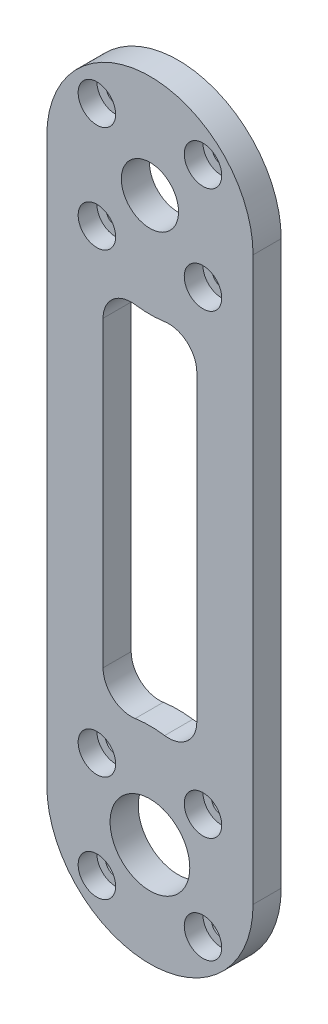
ISO-10303-21;
HEADER;
FILE_DESCRIPTION(('STEP AP214'),'2;1');
FILE_NAME('part.step','',(''),(''),'','','');
FILE_SCHEMA(('AUTOMOTIVE_DESIGN { 1 0 10303 214 1 1 1 1 }'));
ENDSEC;
DATA;
#1=APPLICATION_CONTEXT('core data for automotive mechanical design processes');
#2=APPLICATION_PROTOCOL_DEFINITION('international standard','automotive_design',2000,#1);
#3=PRODUCT_CONTEXT('',#1,'mechanical');
#4=PRODUCT('Part','Part','',(#3));
#5=PRODUCT_RELATED_PRODUCT_CATEGORY('part','',(#4));
#6=PRODUCT_DEFINITION_FORMATION('','',#4);
#7=PRODUCT_DEFINITION_CONTEXT('part definition',#1,'design');
#8=PRODUCT_DEFINITION('design','',#6,#7);
#9=PRODUCT_DEFINITION_SHAPE('','',#8);
#10=(LENGTH_UNIT() NAMED_UNIT(*) SI_UNIT(.MILLI.,.METRE.));
#11=(NAMED_UNIT(*) PLANE_ANGLE_UNIT() SI_UNIT($,.RADIAN.));
#12=(NAMED_UNIT(*) SI_UNIT($,.STERADIAN.) SOLID_ANGLE_UNIT());
#13=UNCERTAINTY_MEASURE_WITH_UNIT(LENGTH_MEASURE(1.E-05),#10,'distance_accuracy_value','');
#14=(GEOMETRIC_REPRESENTATION_CONTEXT(3) GLOBAL_UNCERTAINTY_ASSIGNED_CONTEXT((#13)) GLOBAL_UNIT_ASSIGNED_CONTEXT((#10,
#11,#12)) REPRESENTATION_CONTEXT('',''));
#15=CARTESIAN_POINT('',(0.,0.,0.));
#16=DIRECTION('',(0.,0.,1.));
#17=DIRECTION('',(1.,0.,0.));
#18=AXIS2_PLACEMENT_3D('',#15,#16,#17);
#19=CARTESIAN_POINT('',(5.65685424949247,24.3431457505077,-8.62670273047588));
#20=DIRECTION('',(0.,0.,1.));
#21=DIRECTION('',(1.,0.,0.));
#22=AXIS2_PLACEMENT_3D('',#19,#20,#21);
#23=CYLINDRICAL_SURFACE('',#22,1.);
#24=CARTESIAN_POINT('',(5.65685424949247,24.3431457505077,0.));
#25=DIRECTION('',(0.,0.,1.));
#26=DIRECTION('',(1.,0.,0.));
#27=AXIS2_PLACEMENT_3D('',#24,#25,#26);
#28=CIRCLE('',#27,1.);
#29=CARTESIAN_POINT('',(6.65685424949247,24.3431457505077,0.));
#30=VERTEX_POINT('',#29);
#31=EDGE_CURVE('E426',#30,#30,#28,.F.);
#32=ORIENTED_EDGE('',*,*,#31,.T.);
#33=EDGE_LOOP('',(#32));
#34=FACE_BOUND('',#33,.T.);
#35=CARTESIAN_POINT('',(5.65685424949247,24.3431457505077,1.));
#36=DIRECTION('',(0.,0.,1.));
#37=DIRECTION('',(1.,0.,0.));
#38=AXIS2_PLACEMENT_3D('',#35,#36,#37);
#39=CIRCLE('',#38,1.);
#40=CARTESIAN_POINT('',(6.65685424949247,24.3431457505077,1.));
#41=VERTEX_POINT('',#40);
#42=EDGE_CURVE('E436',#41,#41,#39,.F.);
#43=ORIENTED_EDGE('',*,*,#42,.F.);
#44=EDGE_LOOP('',(#43));
#45=FACE_BOUND('',#44,.T.);
#46=ADVANCED_FACE('F41',(#34,#45),#23,.F.);
#47=CARTESIAN_POINT('',(-5.65685424949235,24.3431457505076,-8.62670273047588));
#48=DIRECTION('',(0.,0.,1.));
#49=DIRECTION('',(1.,0.,0.));
#50=AXIS2_PLACEMENT_3D('',#47,#48,#49);
#51=CYLINDRICAL_SURFACE('',#50,1.);
#52=CARTESIAN_POINT('',(-5.65685424949235,24.3431457505076,0.));
#53=DIRECTION('',(0.,0.,1.));
#54=DIRECTION('',(1.,0.,0.));
#55=AXIS2_PLACEMENT_3D('',#52,#53,#54);
#56=CIRCLE('',#55,1.);
#57=CARTESIAN_POINT('',(-4.65685424949235,24.3431457505076,0.));
#58=VERTEX_POINT('',#57);
#59=EDGE_CURVE('E423',#58,#58,#56,.F.);
#60=ORIENTED_EDGE('',*,*,#59,.T.);
#61=EDGE_LOOP('',(#60));
#62=FACE_BOUND('',#61,.T.);
#63=CARTESIAN_POINT('',(-5.65685424949235,24.3431457505076,1.));
#64=DIRECTION('',(0.,0.,1.));
#65=DIRECTION('',(1.,0.,0.));
#66=AXIS2_PLACEMENT_3D('',#63,#64,#65);
#67=CIRCLE('',#66,1.);
#68=CARTESIAN_POINT('',(-4.65685424949235,24.3431457505076,1.));
#69=VERTEX_POINT('',#68);
#70=EDGE_CURVE('E434',#69,#69,#67,.F.);
#71=ORIENTED_EDGE('',*,*,#70,.F.);
#72=EDGE_LOOP('',(#71));
#73=FACE_BOUND('',#72,.T.);
#74=ADVANCED_FACE('F262',(#62,#73),#51,.F.);
#75=CARTESIAN_POINT('',(-5.65685424949243,35.6568542494923,-8.62670273047588));
#76=DIRECTION('',(0.,0.,1.));
#77=DIRECTION('',(1.,0.,0.));
#78=AXIS2_PLACEMENT_3D('',#75,#76,#77);
#79=CYLINDRICAL_SURFACE('',#78,1.);
#80=CARTESIAN_POINT('',(-5.65685424949243,35.6568542494923,0.));
#81=DIRECTION('',(0.,0.,1.));
#82=DIRECTION('',(1.,0.,0.));
#83=AXIS2_PLACEMENT_3D('',#80,#81,#82);
#84=CIRCLE('',#83,1.);
#85=CARTESIAN_POINT('',(-4.65685424949243,35.6568542494923,0.));
#86=VERTEX_POINT('',#85);
#87=EDGE_CURVE('E420',#86,#86,#84,.F.);
#88=ORIENTED_EDGE('',*,*,#87,.T.);
#89=EDGE_LOOP('',(#88));
#90=FACE_BOUND('',#89,.T.);
#91=CARTESIAN_POINT('',(-5.65685424949243,35.6568542494923,1.));
#92=DIRECTION('',(0.,0.,1.));
#93=DIRECTION('',(1.,0.,0.));
#94=AXIS2_PLACEMENT_3D('',#91,#92,#93);
#95=CIRCLE('',#94,1.);
#96=CARTESIAN_POINT('',(-4.65685424949243,35.6568542494923,1.));
#97=VERTEX_POINT('',#96);
#98=EDGE_CURVE('E444',#97,#97,#95,.F.);
#99=ORIENTED_EDGE('',*,*,#98,.F.);
#100=EDGE_LOOP('',(#99));
#101=FACE_BOUND('',#100,.T.);
#102=ADVANCED_FACE('F268',(#90,#101),#79,.F.);
#103=CARTESIAN_POINT('',(5.65685424949234,35.6568542494924,-8.62670273047588));
#104=DIRECTION('',(0.,0.,1.));
#105=DIRECTION('',(1.,0.,0.));
#106=AXIS2_PLACEMENT_3D('',#103,#104,#105);
#107=CYLINDRICAL_SURFACE('',#106,1.);
#108=CARTESIAN_POINT('',(5.65685424949234,35.6568542494924,0.));
#109=DIRECTION('',(0.,0.,1.));
#110=DIRECTION('',(1.,0.,0.));
#111=AXIS2_PLACEMENT_3D('',#108,#109,#110);
#112=CIRCLE('',#111,1.);
#113=CARTESIAN_POINT('',(6.65685424949234,35.6568542494924,0.));
#114=VERTEX_POINT('',#113);
#115=EDGE_CURVE('E386',#114,#114,#112,.F.);
#116=ORIENTED_EDGE('',*,*,#115,.T.);
#117=EDGE_LOOP('',(#116));
#118=FACE_BOUND('',#117,.T.);
#119=CARTESIAN_POINT('',(5.65685424949234,35.6568542494924,1.));
#120=DIRECTION('',(0.,0.,1.));
#121=DIRECTION('',(1.,0.,0.));
#122=AXIS2_PLACEMENT_3D('',#119,#120,#121);
#123=CIRCLE('',#122,1.);
#124=CARTESIAN_POINT('',(6.65685424949234,35.6568542494924,1.));
#125=VERTEX_POINT('',#124);
#126=EDGE_CURVE('E417',#125,#125,#123,.F.);
#127=ORIENTED_EDGE('',*,*,#126,.F.);
#128=EDGE_LOOP('',(#127));
#129=FACE_BOUND('',#128,.T.);
#130=ADVANCED_FACE('F286',(#118,#129),#107,.F.);
#131=CARTESIAN_POINT('',(-5.65685424949239,-35.6568542494924,-12.0208152801713));
#132=DIRECTION('',(0.,0.,1.));
#133=DIRECTION('',(1.,0.,0.));
#134=AXIS2_PLACEMENT_3D('',#131,#132,#133);
#135=CYLINDRICAL_SURFACE('',#134,1.1);
#136=CARTESIAN_POINT('',(-5.65685424949239,-35.6568542494924,0.));
#137=DIRECTION('',(0.,0.,1.));
#138=DIRECTION('',(1.,0.,0.));
#139=AXIS2_PLACEMENT_3D('',#136,#137,#138);
#140=CIRCLE('',#139,1.1);
#141=CARTESIAN_POINT('',(-4.55685424949239,-35.6568542494924,0.));
#142=VERTEX_POINT('',#141);
#143=EDGE_CURVE('E372',#142,#142,#140,.F.);
#144=ORIENTED_EDGE('',*,*,#143,.T.);
#145=EDGE_LOOP('',(#144));
#146=FACE_BOUND('',#145,.T.);
#147=CARTESIAN_POINT('',(-5.65685424949239,-35.6568542494924,1.));
#148=DIRECTION('',(0.,0.,1.));
#149=DIRECTION('',(1.,0.,0.));
#150=AXIS2_PLACEMENT_3D('',#147,#148,#149);
#151=CIRCLE('',#150,1.1);
#152=CARTESIAN_POINT('',(-4.55685424949239,-35.6568542494924,1.));
#153=VERTEX_POINT('',#152);
#154=EDGE_CURVE('E389',#153,#153,#151,.F.);
#155=ORIENTED_EDGE('',*,*,#154,.F.);
#156=EDGE_LOOP('',(#155));
#157=FACE_BOUND('',#156,.T.);
#158=ADVANCED_FACE('F289',(#146,#157),#135,.F.);
#159=CARTESIAN_POINT('',(5.65685424949235,-35.6568542494924,-12.0208152801713));
#160=DIRECTION('',(0.,0.,1.));
#161=DIRECTION('',(1.,0.,0.));
#162=AXIS2_PLACEMENT_3D('',#159,#160,#161);
#163=CYLINDRICAL_SURFACE('',#162,1.1);
#164=CARTESIAN_POINT('',(5.65685424949235,-35.6568542494924,0.));
#165=DIRECTION('',(0.,0.,1.));
#166=DIRECTION('',(1.,0.,0.));
#167=AXIS2_PLACEMENT_3D('',#164,#165,#166);
#168=CIRCLE('',#167,1.1);
#169=CARTESIAN_POINT('',(6.75685424949235,-35.6568542494924,0.));
#170=VERTEX_POINT('',#169);
#171=EDGE_CURVE('E367',#170,#170,#168,.F.);
#172=ORIENTED_EDGE('',*,*,#171,.T.);
#173=EDGE_LOOP('',(#172));
#174=FACE_BOUND('',#173,.T.);
#175=CARTESIAN_POINT('',(5.65685424949235,-35.6568542494924,1.));
#176=DIRECTION('',(0.,0.,1.));
#177=DIRECTION('',(1.,0.,0.));
#178=AXIS2_PLACEMENT_3D('',#175,#176,#177);
#179=CIRCLE('',#178,1.1);
#180=CARTESIAN_POINT('',(6.75685424949235,-35.6568542494924,1.));
#181=VERTEX_POINT('',#180);
#182=EDGE_CURVE('E373',#181,#181,#179,.F.);
#183=ORIENTED_EDGE('',*,*,#182,.F.);
#184=EDGE_LOOP('',(#183));
#185=FACE_BOUND('',#184,.T.);
#186=ADVANCED_FACE('F321',(#174,#185),#163,.F.);
#187=CARTESIAN_POINT('',(-5.65685424949231,-24.3431457505075,-12.0208152801713));
#188=DIRECTION('',(0.,0.,1.));
#189=DIRECTION('',(1.,0.,0.));
#190=AXIS2_PLACEMENT_3D('',#187,#188,#189);
#191=CYLINDRICAL_SURFACE('',#190,1.1);
#192=CARTESIAN_POINT('',(-5.65685424949231,-24.3431457505075,0.));
#193=DIRECTION('',(0.,0.,1.));
#194=DIRECTION('',(1.,0.,0.));
#195=AXIS2_PLACEMENT_3D('',#192,#193,#194);
#196=CIRCLE('',#195,1.1);
#197=CARTESIAN_POINT('',(-4.55685424949231,-24.3431457505075,0.));
#198=VERTEX_POINT('',#197);
#199=EDGE_CURVE('E369',#198,#198,#196,.F.);
#200=ORIENTED_EDGE('',*,*,#199,.T.);
#201=EDGE_LOOP('',(#200));
#202=FACE_BOUND('',#201,.T.);
#203=CARTESIAN_POINT('',(-5.65685424949231,-24.3431457505075,1.));
#204=DIRECTION('',(0.,0.,1.));
#205=DIRECTION('',(1.,0.,0.));
#206=AXIS2_PLACEMENT_3D('',#203,#204,#205);
#207=CIRCLE('',#206,1.1);
#208=CARTESIAN_POINT('',(-4.55685424949231,-24.3431457505075,1.));
#209=VERTEX_POINT('',#208);
#210=EDGE_CURVE('E378',#209,#209,#207,.F.);
#211=ORIENTED_EDGE('',*,*,#210,.F.);
#212=EDGE_LOOP('',(#211));
#213=FACE_BOUND('',#212,.T.);
#214=ADVANCED_FACE('F325',(#202,#213),#191,.F.);
#215=CARTESIAN_POINT('',(5.65685424949239,-24.3431457505076,-12.0208152801713));
#216=DIRECTION('',(0.,0.,1.));
#217=DIRECTION('',(1.,0.,0.));
#218=AXIS2_PLACEMENT_3D('',#215,#216,#217);
#219=CYLINDRICAL_SURFACE('',#218,1.1);
#220=CARTESIAN_POINT('',(5.65685424949239,-24.3431457505076,0.));
#221=DIRECTION('',(0.,0.,1.));
#222=DIRECTION('',(1.,0.,0.));
#223=AXIS2_PLACEMENT_3D('',#220,#221,#222);
#224=CIRCLE('',#223,1.1);
#225=CARTESIAN_POINT('',(6.75685424949239,-24.3431457505076,0.));
#226=VERTEX_POINT('',#225);
#227=EDGE_CURVE('E221',#226,#226,#224,.F.);
#228=ORIENTED_EDGE('',*,*,#227,.T.);
#229=EDGE_LOOP('',(#228));
#230=FACE_BOUND('',#229,.T.);
#231=CARTESIAN_POINT('',(5.65685424949239,-24.3431457505076,1.));
#232=DIRECTION('',(0.,0.,1.));
#233=DIRECTION('',(1.,0.,0.));
#234=AXIS2_PLACEMENT_3D('',#231,#232,#233);
#235=CIRCLE('',#234,1.1);
#236=CARTESIAN_POINT('',(6.75685424949239,-24.3431457505076,1.));
#237=VERTEX_POINT('',#236);
#238=EDGE_CURVE('E348',#237,#237,#235,.F.);
#239=ORIENTED_EDGE('',*,*,#238,.F.);
#240=EDGE_LOOP('',(#239));
#241=FACE_BOUND('',#240,.T.);
#242=ADVANCED_FACE('F329',(#230,#241),#219,.F.);
#243=CARTESIAN_POINT('',(0.,30.,3.));
#244=DIRECTION('',(0.,0.,-1.));
#245=DIRECTION('',(-1.,0.,0.));
#246=AXIS2_PLACEMENT_3D('',#243,#244,#245);
#247=CYLINDRICAL_SURFACE('',#246,11.);
#248=CARTESIAN_POINT('',(0.,30.,0.));
#249=DIRECTION('',(0.,0.,1.));
#250=DIRECTION('',(1.,0.,0.));
#251=AXIS2_PLACEMENT_3D('',#248,#249,#250);
#252=CIRCLE('',#251,11.);
#253=CARTESIAN_POINT('',(11.,30.,0.));
#254=VERTEX_POINT('',#253);
#255=CARTESIAN_POINT('',(-11.,30.,0.));
#256=VERTEX_POINT('',#255);
#257=EDGE_CURVE('E154',#254,#256,#252,.T.);
#258=ORIENTED_EDGE('',*,*,#257,.T.);
#259=DIRECTION('',(0.,0.,-1.));
#260=VECTOR('',#259,1.);
#261=CARTESIAN_POINT('',(-11.,30.,3.));
#262=LINE('',#261,#260);
#263=CARTESIAN_POINT('',(-11.,30.,3.));
#264=VERTEX_POINT('',#263);
#265=EDGE_CURVE('E135',#264,#256,#262,.T.);
#266=ORIENTED_EDGE('',*,*,#265,.F.);
#267=CARTESIAN_POINT('',(0.,30.,3.));
#268=DIRECTION('',(0.,0.,1.));
#269=DIRECTION('',(1.,0.,0.));
#270=AXIS2_PLACEMENT_3D('',#267,#268,#269);
#271=CIRCLE('',#270,11.);
#272=CARTESIAN_POINT('',(11.,30.,3.));
#273=VERTEX_POINT('',#272);
#274=EDGE_CURVE('E142',#273,#264,#271,.T.);
#275=ORIENTED_EDGE('',*,*,#274,.F.);
#276=DIRECTION('',(0.,0.,-1.));
#277=VECTOR('',#276,1.);
#278=CARTESIAN_POINT('',(11.,30.,3.));
#279=LINE('',#278,#277);
#280=EDGE_CURVE('E227',#273,#254,#279,.T.);
#281=ORIENTED_EDGE('',*,*,#280,.T.);
#282=EDGE_LOOP('',(#258,#266,#275,#281));
#283=FACE_BOUND('',#282,.T.);
#284=ADVANCED_FACE('F152',(#283),#247,.T.);
#285=CARTESIAN_POINT('',(-11.,0.,3.));
#286=DIRECTION('',(1.,0.,0.));
#287=DIRECTION('',(0.,1.,0.));
#288=AXIS2_PLACEMENT_3D('',#285,#286,#287);
#289=PLANE('',#288);
#290=DIRECTION('',(0.,-1.,0.));
#291=VECTOR('',#290,1.);
#292=CARTESIAN_POINT('',(-11.,0.,0.));
#293=LINE('',#292,#291);
#294=CARTESIAN_POINT('',(-11.,-30.,0.));
#295=VERTEX_POINT('',#294);
#296=EDGE_CURVE('E235',#256,#295,#293,.T.);
#297=ORIENTED_EDGE('',*,*,#296,.T.);
#298=DIRECTION('',(0.,0.,-1.));
#299=VECTOR('',#298,1.);
#300=CARTESIAN_POINT('',(-11.,-30.,3.));
#301=LINE('',#300,#299);
#302=CARTESIAN_POINT('',(-11.,-30.,3.));
#303=VERTEX_POINT('',#302);
#304=EDGE_CURVE('E138',#303,#295,#301,.T.);
#305=ORIENTED_EDGE('',*,*,#304,.F.);
#306=DIRECTION('',(0.,-1.,0.));
#307=VECTOR('',#306,1.);
#308=CARTESIAN_POINT('',(-11.,0.,3.));
#309=LINE('',#308,#307);
#310=EDGE_CURVE('E131',#264,#303,#309,.T.);
#311=ORIENTED_EDGE('',*,*,#310,.F.);
#312=ORIENTED_EDGE('',*,*,#265,.T.);
#313=EDGE_LOOP('',(#297,#305,#311,#312));
#314=FACE_BOUND('',#313,.T.);
#315=ADVANCED_FACE('F133',(#314),#289,.F.);
#316=CARTESIAN_POINT('',(0.,-30.,3.));
#317=DIRECTION('',(0.,0.,-1.));
#318=DIRECTION('',(-1.,0.,0.));
#319=AXIS2_PLACEMENT_3D('',#316,#317,#318);
#320=CYLINDRICAL_SURFACE('',#319,11.);
#321=CARTESIAN_POINT('',(0.,-30.,0.));
#322=DIRECTION('',(0.,0.,1.));
#323=DIRECTION('',(1.,0.,0.));
#324=AXIS2_PLACEMENT_3D('',#321,#322,#323);
#325=CIRCLE('',#324,11.);
#326=CARTESIAN_POINT('',(11.,-30.,0.));
#327=VERTEX_POINT('',#326);
#328=EDGE_CURVE('E218',#295,#327,#325,.T.);
#329=ORIENTED_EDGE('',*,*,#328,.T.);
#330=DIRECTION('',(0.,0.,-1.));
#331=VECTOR('',#330,1.);
#332=CARTESIAN_POINT('',(11.,-30.,3.));
#333=LINE('',#332,#331);
#334=CARTESIAN_POINT('',(11.,-30.,3.));
#335=VERTEX_POINT('',#334);
#336=EDGE_CURVE('E159',#335,#327,#333,.T.);
#337=ORIENTED_EDGE('',*,*,#336,.F.);
#338=CARTESIAN_POINT('',(0.,-30.,3.));
#339=DIRECTION('',(0.,0.,1.));
#340=DIRECTION('',(1.,0.,0.));
#341=AXIS2_PLACEMENT_3D('',#338,#339,#340);
#342=CIRCLE('',#341,11.);
#343=EDGE_CURVE('E141',#303,#335,#342,.T.);
#344=ORIENTED_EDGE('',*,*,#343,.F.);
#345=ORIENTED_EDGE('',*,*,#304,.T.);
#346=EDGE_LOOP('',(#329,#337,#344,#345));
#347=FACE_BOUND('',#346,.T.);
#348=ADVANCED_FACE('F244',(#347),#320,.T.);
#349=CARTESIAN_POINT('',(5.,0.,3.));
#350=DIRECTION('',(1.,0.,0.));
#351=DIRECTION('',(0.,0.,-1.));
#352=AXIS2_PLACEMENT_3D('',#349,#350,#351);
#353=PLANE('',#352);
#354=DIRECTION('',(0.,-1.,0.));
#355=VECTOR('',#354,1.);
#356=CARTESIAN_POINT('',(5.,0.,0.));
#357=LINE('',#356,#355);
#358=CARTESIAN_POINT('',(5.,16.143593539449,0.));
#359=VERTEX_POINT('',#358);
#360=CARTESIAN_POINT('',(5.,-16.143593539449,0.));
#361=VERTEX_POINT('',#360);
#362=EDGE_CURVE('E196',#359,#361,#357,.T.);
#363=ORIENTED_EDGE('',*,*,#362,.T.);
#364=DIRECTION('',(0.,0.,1.));
#365=VECTOR('',#364,1.);
#366=CARTESIAN_POINT('',(5.,-16.143593539449,3.));
#367=LINE('',#366,#365);
#368=CARTESIAN_POINT('',(5.,-16.143593539449,3.));
#369=VERTEX_POINT('',#368);
#370=EDGE_CURVE('E173',#361,#369,#367,.T.);
#371=ORIENTED_EDGE('',*,*,#370,.T.);
#372=DIRECTION('',(0.,-1.,0.));
#373=VECTOR('',#372,1.);
#374=CARTESIAN_POINT('',(5.,0.,3.));
#375=LINE('',#374,#373);
#376=CARTESIAN_POINT('',(5.,16.143593539449,3.));
#377=VERTEX_POINT('',#376);
#378=EDGE_CURVE('E206',#377,#369,#375,.T.);
#379=ORIENTED_EDGE('',*,*,#378,.F.);
#380=DIRECTION('',(0.,0.,1.));
#381=VECTOR('',#380,1.);
#382=CARTESIAN_POINT('',(5.,16.143593539449,0.));
#383=LINE('',#382,#381);
#384=EDGE_CURVE('E170',#377,#359,#383,.F.);
#385=ORIENTED_EDGE('',*,*,#384,.T.);
#386=EDGE_LOOP('',(#363,#371,#379,#385));
#387=FACE_BOUND('',#386,.T.);
#388=ADVANCED_FACE('F209',(#387),#353,.F.);
#389=CARTESIAN_POINT('',(1.57142857142857,-19.1128234952813,0.));
#390=VERTEX_POINT('',#389);
#391=CARTESIAN_POINT('',(-1.57142857142857,-19.1128234952813,0.));
#392=VERTEX_POINT('',#391);
#393=EDGE_CURVE('E229',#390,#392,#325,.T.);
#394=ORIENTED_EDGE('',*,*,#393,.T.);
#395=DIRECTION('',(0.,0.,-1.));
#396=VECTOR('',#395,1.);
#397=CARTESIAN_POINT('',(-1.57142857142857,-19.1128234952813,3.));
#398=LINE('',#397,#396);
#399=CARTESIAN_POINT('',(-1.57142857142857,-19.1128234952813,3.));
#400=VERTEX_POINT('',#399);
#401=EDGE_CURVE('E168',#392,#400,#398,.F.);
#402=ORIENTED_EDGE('',*,*,#401,.T.);
#403=CARTESIAN_POINT('',(1.57142857142857,-19.1128234952813,3.));
#404=VERTEX_POINT('',#403);
#405=EDGE_CURVE('E211',#404,#400,#342,.T.);
#406=ORIENTED_EDGE('',*,*,#405,.F.);
#407=DIRECTION('',(0.,0.,-1.));
#408=VECTOR('',#407,1.);
#409=CARTESIAN_POINT('',(1.57142857142857,-19.1128234952813,3.));
#410=LINE('',#409,#408);
#411=EDGE_CURVE('E165',#404,#390,#410,.T.);
#412=ORIENTED_EDGE('',*,*,#411,.T.);
#413=EDGE_LOOP('',(#394,#402,#406,#412));
#414=FACE_BOUND('',#413,.T.);
#415=ADVANCED_FACE('F670',(#414),#320,.T.);
#416=CARTESIAN_POINT('',(-5.,0.,3.));
#417=DIRECTION('',(1.,0.,0.));
#418=DIRECTION('',(0.,0.,-1.));
#419=AXIS2_PLACEMENT_3D('',#416,#417,#418);
#420=PLANE('',#419);
#421=DIRECTION('',(0.,-1.,0.));
#422=VECTOR('',#421,1.);
#423=CARTESIAN_POINT('',(-5.,0.,3.));
#424=LINE('',#423,#422);
#425=CARTESIAN_POINT('',(-5.,16.143593539449,3.));
#426=VERTEX_POINT('',#425);
#427=CARTESIAN_POINT('',(-5.,-16.143593539449,3.));
#428=VERTEX_POINT('',#427);
#429=EDGE_CURVE('E215',#426,#428,#424,.T.);
#430=ORIENTED_EDGE('',*,*,#429,.T.);
#431=DIRECTION('',(0.,0.,-1.));
#432=VECTOR('',#431,1.);
#433=CARTESIAN_POINT('',(-5.,-16.143593539449,3.));
#434=LINE('',#433,#432);
#435=CARTESIAN_POINT('',(-5.,-16.143593539449,0.));
#436=VERTEX_POINT('',#435);
#437=EDGE_CURVE('E157',#428,#436,#434,.T.);
#438=ORIENTED_EDGE('',*,*,#437,.T.);
#439=DIRECTION('',(0.,-1.,0.));
#440=VECTOR('',#439,1.);
#441=CARTESIAN_POINT('',(-5.,0.,0.));
#442=LINE('',#441,#440);
#443=CARTESIAN_POINT('',(-5.,16.143593539449,0.));
#444=VERTEX_POINT('',#443);
#445=EDGE_CURVE('E201',#444,#436,#442,.T.);
#446=ORIENTED_EDGE('',*,*,#445,.F.);
#447=DIRECTION('',(0.,0.,-1.));
#448=VECTOR('',#447,1.);
#449=CARTESIAN_POINT('',(-5.,16.143593539449,3.));
#450=LINE('',#449,#448);
#451=EDGE_CURVE('E155',#444,#426,#450,.F.);
#452=ORIENTED_EDGE('',*,*,#451,.T.);
#453=EDGE_LOOP('',(#430,#438,#446,#452));
#454=FACE_BOUND('',#453,.T.);
#455=ADVANCED_FACE('F671',(#454),#420,.T.);
#456=CARTESIAN_POINT('',(-1.57142857142858,19.1128234952813,3.));
#457=VERTEX_POINT('',#456);
#458=CARTESIAN_POINT('',(1.57142857142857,19.1128234952813,3.));
#459=VERTEX_POINT('',#458);
#460=EDGE_CURVE('E150',#457,#459,#271,.T.);
#461=ORIENTED_EDGE('',*,*,#460,.F.);
#462=DIRECTION('',(0.,0.,-1.));
#463=VECTOR('',#462,1.);
#464=CARTESIAN_POINT('',(-1.57142857142858,19.1128234952813,3.));
#465=LINE('',#464,#463);
#466=CARTESIAN_POINT('',(-1.57142857142858,19.1128234952813,0.));
#467=VERTEX_POINT('',#466);
#468=EDGE_CURVE('E176',#457,#467,#465,.T.);
#469=ORIENTED_EDGE('',*,*,#468,.T.);
#470=CARTESIAN_POINT('',(1.57142857142857,19.1128234952813,0.));
#471=VERTEX_POINT('',#470);
#472=EDGE_CURVE('E194',#467,#471,#252,.T.);
#473=ORIENTED_EDGE('',*,*,#472,.T.);
#474=DIRECTION('',(0.,0.,-1.));
#475=VECTOR('',#474,1.);
#476=CARTESIAN_POINT('',(1.57142857142857,19.1128234952813,3.));
#477=LINE('',#476,#475);
#478=EDGE_CURVE('E56',#471,#459,#477,.F.);
#479=ORIENTED_EDGE('',*,*,#478,.T.);
#480=EDGE_LOOP('',(#461,#469,#473,#479));
#481=FACE_BOUND('',#480,.T.);
#482=ADVANCED_FACE('F199',(#481),#247,.T.);
#483=CARTESIAN_POINT('',(11.,0.,3.));
#484=DIRECTION('',(1.,0.,0.));
#485=DIRECTION('',(0.,1.,0.));
#486=AXIS2_PLACEMENT_3D('',#483,#484,#485);
#487=PLANE('',#486);
#488=DIRECTION('',(0.,-1.,0.));
#489=VECTOR('',#488,1.);
#490=CARTESIAN_POINT('',(11.,0.,0.));
#491=LINE('',#490,#489);
#492=EDGE_CURVE('E212',#254,#327,#491,.T.);
#493=ORIENTED_EDGE('',*,*,#492,.F.);
#494=ORIENTED_EDGE('',*,*,#280,.F.);
#495=DIRECTION('',(0.,-1.,0.));
#496=VECTOR('',#495,1.);
#497=CARTESIAN_POINT('',(11.,0.,3.));
#498=LINE('',#497,#496);
#499=EDGE_CURVE('E148',#273,#335,#498,.T.);
#500=ORIENTED_EDGE('',*,*,#499,.T.);
#501=ORIENTED_EDGE('',*,*,#336,.T.);
#502=EDGE_LOOP('',(#493,#494,#500,#501));
#503=FACE_BOUND('',#502,.T.);
#504=ADVANCED_FACE('F241',(#503),#487,.T.);
#505=CARTESIAN_POINT('',(0.,0.,3.));
#506=DIRECTION('',(0.,0.,1.));
#507=DIRECTION('',(1.,0.,0.));
#508=AXIS2_PLACEMENT_3D('',#505,#506,#507);
#509=PLANE('',#508);
#510=CARTESIAN_POINT('',(-5.65685424949243,35.6568542494923,3.));
#511=DIRECTION('',(0.,0.,1.));
#512=DIRECTION('',(0.,1.,0.));
#513=AXIS2_PLACEMENT_3D('',#510,#511,#512);
#514=CIRCLE('',#513,2.00000000000001);
#515=CARTESIAN_POINT('',(-5.65685424949244,37.6568542494923,3.));
#516=VERTEX_POINT('',#515);
#517=EDGE_CURVE('E452',#516,#516,#514,.T.);
#518=ORIENTED_EDGE('',*,*,#517,.F.);
#519=EDGE_LOOP('',(#518));
#520=FACE_BOUND('',#519,.T.);
#521=CARTESIAN_POINT('',(-5.65685424949235,24.3431457505076,3.));
#522=DIRECTION('',(0.,0.,1.));
#523=DIRECTION('',(-1.,0.,0.));
#524=AXIS2_PLACEMENT_3D('',#521,#522,#523);
#525=CIRCLE('',#524,2.00000000000001);
#526=CARTESIAN_POINT('',(-7.65685424949236,24.3431457505076,3.));
#527=VERTEX_POINT('',#526);
#528=EDGE_CURVE('E445',#527,#527,#525,.T.);
#529=ORIENTED_EDGE('',*,*,#528,.F.);
#530=EDGE_LOOP('',(#529));
#531=FACE_BOUND('',#530,.T.);
#532=CARTESIAN_POINT('',(5.65685424949247,24.3431457505077,3.));
#533=DIRECTION('',(0.,0.,1.));
#534=DIRECTION('',(0.,-1.,0.));
#535=AXIS2_PLACEMENT_3D('',#532,#533,#534);
#536=CIRCLE('',#535,2.00000000000001);
#537=CARTESIAN_POINT('',(5.65685424949249,22.3431457505077,3.));
#538=VERTEX_POINT('',#537);
#539=EDGE_CURVE('E435',#538,#538,#536,.T.);
#540=ORIENTED_EDGE('',*,*,#539,.F.);
#541=EDGE_LOOP('',(#540));
#542=FACE_BOUND('',#541,.T.);
#543=CARTESIAN_POINT('',(5.65685424949234,35.6568542494924,3.));
#544=DIRECTION('',(0.,0.,1.));
#545=DIRECTION('',(1.,0.,0.));
#546=AXIS2_PLACEMENT_3D('',#543,#544,#545);
#547=CIRCLE('',#546,2.00000000000001);
#548=CARTESIAN_POINT('',(7.65685424949235,35.6568542494924,3.));
#549=VERTEX_POINT('',#548);
#550=EDGE_CURVE('E416',#549,#549,#547,.T.);
#551=ORIENTED_EDGE('',*,*,#550,.F.);
#552=EDGE_LOOP('',(#551));
#553=FACE_BOUND('',#552,.T.);
#554=CARTESIAN_POINT('',(0.,30.,3.));
#555=DIRECTION('',(0.,0.,1.));
#556=DIRECTION('',(1.,0.,0.));
#557=AXIS2_PLACEMENT_3D('',#554,#555,#556);
#558=CIRCLE('',#557,3.05);
#559=CARTESIAN_POINT('',(3.05,30.,3.));
#560=VERTEX_POINT('',#559);
#561=EDGE_CURVE('E408',#560,#560,#558,.T.);
#562=ORIENTED_EDGE('',*,*,#561,.F.);
#563=EDGE_LOOP('',(#562));
#564=FACE_BOUND('',#563,.T.);
#565=CARTESIAN_POINT('',(5.65685424949235,-35.6568542494924,3.));
#566=DIRECTION('',(0.,0.,1.));
#567=DIRECTION('',(0.,-1.,0.));
#568=AXIS2_PLACEMENT_3D('',#565,#566,#567);
#569=CIRCLE('',#568,2.);
#570=CARTESIAN_POINT('',(5.65685424949234,-37.6568542494924,3.));
#571=VERTEX_POINT('',#570);
#572=EDGE_CURVE('E392',#571,#571,#569,.T.);
#573=ORIENTED_EDGE('',*,*,#572,.F.);
#574=EDGE_LOOP('',(#573));
#575=FACE_BOUND('',#574,.T.);
#576=CARTESIAN_POINT('',(-5.65685424949239,-35.6568542494924,3.));
#577=DIRECTION('',(0.,0.,1.));
#578=DIRECTION('',(-1.,0.,0.));
#579=AXIS2_PLACEMENT_3D('',#576,#577,#578);
#580=CIRCLE('',#579,2.);
#581=CARTESIAN_POINT('',(-7.65685424949239,-35.6568542494924,3.));
#582=VERTEX_POINT('',#581);
#583=EDGE_CURVE('E381',#582,#582,#580,.T.);
#584=ORIENTED_EDGE('',*,*,#583,.F.);
#585=EDGE_LOOP('',(#584));
#586=FACE_BOUND('',#585,.T.);
#587=CARTESIAN_POINT('',(-5.65685424949231,-24.3431457505075,3.));
#588=DIRECTION('',(0.,0.,1.));
#589=DIRECTION('',(0.,1.,0.));
#590=AXIS2_PLACEMENT_3D('',#587,#588,#589);
#591=CIRCLE('',#590,2.);
#592=CARTESIAN_POINT('',(-5.65685424949229,-22.3431457505075,3.));
#593=VERTEX_POINT('',#592);
#594=EDGE_CURVE('E383',#593,#593,#591,.T.);
#595=ORIENTED_EDGE('',*,*,#594,.F.);
#596=EDGE_LOOP('',(#595));
#597=FACE_BOUND('',#596,.T.);
#598=CARTESIAN_POINT('',(5.65685424949239,-24.3431457505076,3.));
#599=DIRECTION('',(0.,0.,1.));
#600=DIRECTION('',(1.,0.,0.));
#601=AXIS2_PLACEMENT_3D('',#598,#599,#600);
#602=CIRCLE('',#601,2.);
#603=CARTESIAN_POINT('',(7.65685424949239,-24.3431457505076,3.));
#604=VERTEX_POINT('',#603);
#605=EDGE_CURVE('E354',#604,#604,#602,.T.);
#606=ORIENTED_EDGE('',*,*,#605,.F.);
#607=EDGE_LOOP('',(#606));
#608=FACE_BOUND('',#607,.T.);
#609=CARTESIAN_POINT('',(0.,-30.,3.));
#610=DIRECTION('',(0.,0.,1.));
#611=DIRECTION('',(1.,0.,0.));
#612=AXIS2_PLACEMENT_3D('',#609,#610,#611);
#613=CIRCLE('',#612,4.25);
#614=CARTESIAN_POINT('',(4.25,-30.,3.));
#615=VERTEX_POINT('',#614);
#616=EDGE_CURVE('E352',#615,#615,#613,.T.);
#617=ORIENTED_EDGE('',*,*,#616,.F.);
#618=EDGE_LOOP('',(#617));
#619=FACE_BOUND('',#618,.T.);
#620=ORIENTED_EDGE('',*,*,#460,.T.);
#621=CARTESIAN_POINT('',(2.,16.143593539449,3.));
#622=DIRECTION('',(0.,0.,1.));
#623=DIRECTION('',(1.,0.,0.));
#624=AXIS2_PLACEMENT_3D('',#621,#622,#623);
#625=CIRCLE('',#624,3.);
#626=EDGE_CURVE('E12',#459,#377,#625,.F.);
#627=ORIENTED_EDGE('',*,*,#626,.T.);
#628=ORIENTED_EDGE('',*,*,#378,.T.);
#629=CARTESIAN_POINT('',(2.,-16.143593539449,3.));
#630=DIRECTION('',(0.,0.,1.));
#631=DIRECTION('',(1.,0.,0.));
#632=AXIS2_PLACEMENT_3D('',#629,#630,#631);
#633=CIRCLE('',#632,3.);
#634=EDGE_CURVE('E185',#369,#404,#633,.F.);
#635=ORIENTED_EDGE('',*,*,#634,.T.);
#636=ORIENTED_EDGE('',*,*,#405,.T.);
#637=CARTESIAN_POINT('',(-2.,-16.143593539449,3.));
#638=DIRECTION('',(0.,0.,1.));
#639=DIRECTION('',(1.,0.,0.));
#640=AXIS2_PLACEMENT_3D('',#637,#638,#639);
#641=CIRCLE('',#640,3.);
#642=EDGE_CURVE('E181',#400,#428,#641,.F.);
#643=ORIENTED_EDGE('',*,*,#642,.T.);
#644=ORIENTED_EDGE('',*,*,#429,.F.);
#645=CARTESIAN_POINT('',(-2.,16.143593539449,3.));
#646=DIRECTION('',(0.,0.,1.));
#647=DIRECTION('',(1.,0.,0.));
#648=AXIS2_PLACEMENT_3D('',#645,#646,#647);
#649=CIRCLE('',#648,3.);
#650=EDGE_CURVE('E63',#426,#457,#649,.F.);
#651=ORIENTED_EDGE('',*,*,#650,.T.);
#652=EDGE_LOOP('',(#620,#627,#628,#635,#636,#643,#644,#651));
#653=FACE_BOUND('',#652,.T.);
#654=ORIENTED_EDGE('',*,*,#274,.T.);
#655=ORIENTED_EDGE('',*,*,#310,.T.);
#656=ORIENTED_EDGE('',*,*,#343,.T.);
#657=ORIENTED_EDGE('',*,*,#499,.F.);
#658=EDGE_LOOP('',(#654,#655,#656,#657));
#659=FACE_BOUND('',#658,.T.);
#660=ADVANCED_FACE('F146',(#520,#531,#542,#553,#564,#575,#586,#597,#608,#619,#653,#659),#509,.T.);
#661=CARTESIAN_POINT('',(0.,0.,0.));
#662=DIRECTION('',(0.,0.,1.));
#663=DIRECTION('',(1.,0.,0.));
#664=AXIS2_PLACEMENT_3D('',#661,#662,#663);
#665=PLANE('',#664);
#666=ORIENTED_EDGE('',*,*,#87,.F.);
#667=EDGE_LOOP('',(#666));
#668=FACE_BOUND('',#667,.T.);
#669=ORIENTED_EDGE('',*,*,#59,.F.);
#670=EDGE_LOOP('',(#669));
#671=FACE_BOUND('',#670,.T.);
#672=ORIENTED_EDGE('',*,*,#31,.F.);
#673=EDGE_LOOP('',(#672));
#674=FACE_BOUND('',#673,.T.);
#675=ORIENTED_EDGE('',*,*,#115,.F.);
#676=EDGE_LOOP('',(#675));
#677=FACE_BOUND('',#676,.T.);
#678=CARTESIAN_POINT('',(0.,30.,0.));
#679=DIRECTION('',(0.,0.,1.));
#680=DIRECTION('',(1.,0.,0.));
#681=AXIS2_PLACEMENT_3D('',#678,#679,#680);
#682=CIRCLE('',#681,3.05);
#683=CARTESIAN_POINT('',(3.05,30.,0.));
#684=VERTEX_POINT('',#683);
#685=EDGE_CURVE('E405',#684,#684,#682,.F.);
#686=ORIENTED_EDGE('',*,*,#685,.F.);
#687=EDGE_LOOP('',(#686));
#688=FACE_BOUND('',#687,.T.);
#689=ORIENTED_EDGE('',*,*,#199,.F.);
#690=EDGE_LOOP('',(#689));
#691=FACE_BOUND('',#690,.T.);
#692=ORIENTED_EDGE('',*,*,#171,.F.);
#693=EDGE_LOOP('',(#692));
#694=FACE_BOUND('',#693,.T.);
#695=ORIENTED_EDGE('',*,*,#143,.F.);
#696=EDGE_LOOP('',(#695));
#697=FACE_BOUND('',#696,.T.);
#698=CARTESIAN_POINT('',(0.,-30.,0.));
#699=DIRECTION('',(0.,0.,1.));
#700=DIRECTION('',(1.,0.,0.));
#701=AXIS2_PLACEMENT_3D('',#698,#699,#700);
#702=CIRCLE('',#701,4.25);
#703=CARTESIAN_POINT('',(4.25,-30.,0.));
#704=VERTEX_POINT('',#703);
#705=EDGE_CURVE('E230',#704,#704,#702,.F.);
#706=ORIENTED_EDGE('',*,*,#705,.F.);
#707=EDGE_LOOP('',(#706));
#708=FACE_BOUND('',#707,.T.);
#709=ORIENTED_EDGE('',*,*,#227,.F.);
#710=EDGE_LOOP('',(#709));
#711=FACE_BOUND('',#710,.T.);
#712=ORIENTED_EDGE('',*,*,#362,.F.);
#713=CARTESIAN_POINT('',(2.,16.143593539449,0.));
#714=DIRECTION('',(0.,0.,1.));
#715=DIRECTION('',(1.,0.,0.));
#716=AXIS2_PLACEMENT_3D('',#713,#714,#715);
#717=CIRCLE('',#716,3.);
#718=EDGE_CURVE('E49',#359,#471,#717,.T.);
#719=ORIENTED_EDGE('',*,*,#718,.T.);
#720=ORIENTED_EDGE('',*,*,#472,.F.);
#721=CARTESIAN_POINT('',(-2.,16.143593539449,0.));
#722=DIRECTION('',(0.,0.,1.));
#723=DIRECTION('',(1.,0.,0.));
#724=AXIS2_PLACEMENT_3D('',#721,#722,#723);
#725=CIRCLE('',#724,3.);
#726=EDGE_CURVE('E187',#467,#444,#725,.T.);
#727=ORIENTED_EDGE('',*,*,#726,.T.);
#728=ORIENTED_EDGE('',*,*,#445,.T.);
#729=CARTESIAN_POINT('',(-2.,-16.143593539449,0.));
#730=DIRECTION('',(0.,0.,1.));
#731=DIRECTION('',(1.,0.,0.));
#732=AXIS2_PLACEMENT_3D('',#729,#730,#731);
#733=CIRCLE('',#732,3.);
#734=EDGE_CURVE('E179',#436,#392,#733,.T.);
#735=ORIENTED_EDGE('',*,*,#734,.T.);
#736=ORIENTED_EDGE('',*,*,#393,.F.);
#737=CARTESIAN_POINT('',(2.,-16.143593539449,0.));
#738=DIRECTION('',(0.,0.,1.));
#739=DIRECTION('',(1.,0.,0.));
#740=AXIS2_PLACEMENT_3D('',#737,#738,#739);
#741=CIRCLE('',#740,3.);
#742=EDGE_CURVE('E183',#390,#361,#741,.T.);
#743=ORIENTED_EDGE('',*,*,#742,.T.);
#744=EDGE_LOOP('',(#712,#719,#720,#727,#728,#735,#736,#743));
#745=FACE_BOUND('',#744,.T.);
#746=ORIENTED_EDGE('',*,*,#257,.F.);
#747=ORIENTED_EDGE('',*,*,#492,.T.);
#748=ORIENTED_EDGE('',*,*,#328,.F.);
#749=ORIENTED_EDGE('',*,*,#296,.F.);
#750=EDGE_LOOP('',(#746,#747,#748,#749));
#751=FACE_BOUND('',#750,.T.);
#752=ADVANCED_FACE('F192',(#668,#671,#674,#677,#688,#691,#694,#697,#708,#711,#745,#751),#665,.F.);
#753=CARTESIAN_POINT('',(0.,-30.,-12.0208152801713));
#754=DIRECTION('',(0.,0.,1.));
#755=DIRECTION('',(1.,0.,0.));
#756=AXIS2_PLACEMENT_3D('',#753,#754,#755);
#757=CYLINDRICAL_SURFACE('',#756,4.25);
#758=ORIENTED_EDGE('',*,*,#705,.T.);
#759=EDGE_LOOP('',(#758));
#760=FACE_BOUND('',#759,.T.);
#761=ORIENTED_EDGE('',*,*,#616,.T.);
#762=EDGE_LOOP('',(#761));
#763=FACE_BOUND('',#762,.T.);
#764=ADVANCED_FACE('F246',(#760,#763),#757,.F.);
#765=CARTESIAN_POINT('',(5.65685424949239,-24.3431457505076,-5.65685424949239));
#766=DIRECTION('',(0.,0.,1.));
#767=DIRECTION('',(1.,0.,0.));
#768=AXIS2_PLACEMENT_3D('',#765,#766,#767);
#769=CYLINDRICAL_SURFACE('',#768,2.);
#770=CARTESIAN_POINT('',(5.65685424949239,-24.3431457505076,1.));
#771=DIRECTION('',(0.,0.,1.));
#772=DIRECTION('',(1.,0.,0.));
#773=AXIS2_PLACEMENT_3D('',#770,#771,#772);
#774=CIRCLE('',#773,2.);
#775=CARTESIAN_POINT('',(7.65685424949239,-24.3431457505076,1.));
#776=VERTEX_POINT('',#775);
#777=EDGE_CURVE('E350',#776,#776,#774,.F.);
#778=ORIENTED_EDGE('',*,*,#777,.T.);
#779=EDGE_LOOP('',(#778));
#780=FACE_BOUND('',#779,.T.);
#781=ORIENTED_EDGE('',*,*,#605,.T.);
#782=EDGE_LOOP('',(#781));
#783=FACE_BOUND('',#782,.T.);
#784=ADVANCED_FACE('F253',(#780,#783),#769,.F.);
#785=CARTESIAN_POINT('',(0.,0.,1.));
#786=DIRECTION('',(0.,0.,1.));
#787=DIRECTION('',(1.,0.,0.));
#788=AXIS2_PLACEMENT_3D('',#785,#786,#787);
#789=PLANE('',#788);
#790=ORIENTED_EDGE('',*,*,#777,.F.);
#791=EDGE_LOOP('',(#790));
#792=FACE_BOUND('',#791,.T.);
#793=ORIENTED_EDGE('',*,*,#238,.T.);
#794=EDGE_LOOP('',(#793));
#795=FACE_BOUND('',#794,.T.);
#796=ADVANCED_FACE('F317',(#792,#795),#789,.T.);
#797=CARTESIAN_POINT('',(-5.65685424949231,-24.3431457505075,-5.65685424949239));
#798=DIRECTION('',(0.,0.,1.));
#799=DIRECTION('',(1.,0.,0.));
#800=AXIS2_PLACEMENT_3D('',#797,#798,#799);
#801=CYLINDRICAL_SURFACE('',#800,2.);
#802=CARTESIAN_POINT('',(-5.65685424949231,-24.3431457505075,1.));
#803=DIRECTION('',(0.,0.,1.));
#804=DIRECTION('',(1.,0.,0.));
#805=AXIS2_PLACEMENT_3D('',#802,#803,#804);
#806=CIRCLE('',#805,2.);
#807=CARTESIAN_POINT('',(-3.65685424949231,-24.3431457505075,1.));
#808=VERTEX_POINT('',#807);
#809=EDGE_CURVE('E382',#808,#808,#806,.F.);
#810=ORIENTED_EDGE('',*,*,#809,.T.);
#811=EDGE_LOOP('',(#810));
#812=FACE_BOUND('',#811,.T.);
#813=ORIENTED_EDGE('',*,*,#594,.T.);
#814=EDGE_LOOP('',(#813));
#815=FACE_BOUND('',#814,.T.);
#816=ADVANCED_FACE('F313',(#812,#815),#801,.F.);
#817=CARTESIAN_POINT('',(0.,0.,1.));
#818=DIRECTION('',(0.,0.,1.));
#819=DIRECTION('',(1.,0.,0.));
#820=AXIS2_PLACEMENT_3D('',#817,#818,#819);
#821=PLANE('',#820);
#822=ORIENTED_EDGE('',*,*,#809,.F.);
#823=EDGE_LOOP('',(#822));
#824=FACE_BOUND('',#823,.T.);
#825=ORIENTED_EDGE('',*,*,#210,.T.);
#826=EDGE_LOOP('',(#825));
#827=FACE_BOUND('',#826,.T.);
#828=ADVANCED_FACE('F303',(#824,#827),#821,.T.);
#829=CARTESIAN_POINT('',(5.65685424949235,-35.6568542494924,-5.65685424949239));
#830=DIRECTION('',(0.,0.,1.));
#831=DIRECTION('',(1.,0.,0.));
#832=AXIS2_PLACEMENT_3D('',#829,#830,#831);
#833=CYLINDRICAL_SURFACE('',#832,2.);
#834=CARTESIAN_POINT('',(5.65685424949235,-35.6568542494924,1.));
#835=DIRECTION('',(0.,0.,1.));
#836=DIRECTION('',(1.,0.,0.));
#837=AXIS2_PLACEMENT_3D('',#834,#835,#836);
#838=CIRCLE('',#837,2.);
#839=CARTESIAN_POINT('',(7.65685424949235,-35.6568542494924,1.));
#840=VERTEX_POINT('',#839);
#841=EDGE_CURVE('E400',#840,#840,#838,.F.);
#842=ORIENTED_EDGE('',*,*,#841,.T.);
#843=EDGE_LOOP('',(#842));
#844=FACE_BOUND('',#843,.T.);
#845=ORIENTED_EDGE('',*,*,#572,.T.);
#846=EDGE_LOOP('',(#845));
#847=FACE_BOUND('',#846,.T.);
#848=ADVANCED_FACE('F299',(#844,#847),#833,.F.);
#849=CARTESIAN_POINT('',(0.,0.,1.));
#850=DIRECTION('',(0.,0.,1.));
#851=DIRECTION('',(1.,0.,0.));
#852=AXIS2_PLACEMENT_3D('',#849,#850,#851);
#853=PLANE('',#852);
#854=ORIENTED_EDGE('',*,*,#841,.F.);
#855=EDGE_LOOP('',(#854));
#856=FACE_BOUND('',#855,.T.);
#857=ORIENTED_EDGE('',*,*,#182,.T.);
#858=EDGE_LOOP('',(#857));
#859=FACE_BOUND('',#858,.T.);
#860=ADVANCED_FACE('F295',(#856,#859),#853,.T.);
#861=CARTESIAN_POINT('',(-5.65685424949239,-35.6568542494924,-5.65685424949239));
#862=DIRECTION('',(0.,0.,1.));
#863=DIRECTION('',(1.,0.,0.));
#864=AXIS2_PLACEMENT_3D('',#861,#862,#863);
#865=CYLINDRICAL_SURFACE('',#864,2.);
#866=CARTESIAN_POINT('',(-5.65685424949239,-35.6568542494924,1.));
#867=DIRECTION('',(0.,0.,1.));
#868=DIRECTION('',(1.,0.,0.));
#869=AXIS2_PLACEMENT_3D('',#866,#867,#868);
#870=CIRCLE('',#869,2.);
#871=CARTESIAN_POINT('',(-3.65685424949239,-35.6568542494924,1.));
#872=VERTEX_POINT('',#871);
#873=EDGE_CURVE('E393',#872,#872,#870,.F.);
#874=ORIENTED_EDGE('',*,*,#873,.T.);
#875=EDGE_LOOP('',(#874));
#876=FACE_BOUND('',#875,.T.);
#877=ORIENTED_EDGE('',*,*,#583,.T.);
#878=EDGE_LOOP('',(#877));
#879=FACE_BOUND('',#878,.T.);
#880=ADVANCED_FACE('F298',(#876,#879),#865,.F.);
#881=CARTESIAN_POINT('',(0.,0.,1.));
#882=DIRECTION('',(0.,0.,1.));
#883=DIRECTION('',(1.,0.,0.));
#884=AXIS2_PLACEMENT_3D('',#881,#882,#883);
#885=PLANE('',#884);
#886=ORIENTED_EDGE('',*,*,#873,.F.);
#887=EDGE_LOOP('',(#886));
#888=FACE_BOUND('',#887,.T.);
#889=ORIENTED_EDGE('',*,*,#154,.T.);
#890=EDGE_LOOP('',(#889));
#891=FACE_BOUND('',#890,.T.);
#892=ADVANCED_FACE('F293',(#888,#891),#885,.T.);
#893=CARTESIAN_POINT('',(0.,30.,-8.62670273047588));
#894=DIRECTION('',(0.,0.,1.));
#895=DIRECTION('',(1.,0.,0.));
#896=AXIS2_PLACEMENT_3D('',#893,#894,#895);
#897=CYLINDRICAL_SURFACE('',#896,3.05);
#898=ORIENTED_EDGE('',*,*,#685,.T.);
#899=EDGE_LOOP('',(#898));
#900=FACE_BOUND('',#899,.T.);
#901=ORIENTED_EDGE('',*,*,#561,.T.);
#902=EDGE_LOOP('',(#901));
#903=FACE_BOUND('',#902,.T.);
#904=ADVANCED_FACE('F280',(#900,#903),#897,.F.);
#905=CARTESIAN_POINT('',(5.65685424949234,35.6568542494924,-5.6568542494924));
#906=DIRECTION('',(0.,0.,1.));
#907=DIRECTION('',(1.,0.,0.));
#908=AXIS2_PLACEMENT_3D('',#905,#906,#907);
#909=CYLINDRICAL_SURFACE('',#908,2.00000000000001);
#910=CARTESIAN_POINT('',(5.65685424949234,35.6568542494924,1.));
#911=DIRECTION('',(0.,0.,1.));
#912=DIRECTION('',(1.,0.,0.));
#913=AXIS2_PLACEMENT_3D('',#910,#911,#912);
#914=CIRCLE('',#913,2.00000000000001);
#915=CARTESIAN_POINT('',(7.65685424949235,35.6568542494924,1.));
#916=VERTEX_POINT('',#915);
#917=EDGE_CURVE('E411',#916,#916,#914,.F.);
#918=ORIENTED_EDGE('',*,*,#917,.T.);
#919=EDGE_LOOP('',(#918));
#920=FACE_BOUND('',#919,.T.);
#921=ORIENTED_EDGE('',*,*,#550,.T.);
#922=EDGE_LOOP('',(#921));
#923=FACE_BOUND('',#922,.T.);
#924=ADVANCED_FACE('F276',(#920,#923),#909,.F.);
#925=CARTESIAN_POINT('',(0.,0.,1.));
#926=DIRECTION('',(0.,0.,1.));
#927=DIRECTION('',(1.,0.,0.));
#928=AXIS2_PLACEMENT_3D('',#925,#926,#927);
#929=PLANE('',#928);
#930=ORIENTED_EDGE('',*,*,#917,.F.);
#931=EDGE_LOOP('',(#930));
#932=FACE_BOUND('',#931,.T.);
#933=ORIENTED_EDGE('',*,*,#126,.T.);
#934=EDGE_LOOP('',(#933));
#935=FACE_BOUND('',#934,.T.);
#936=ADVANCED_FACE('F279',(#932,#935),#929,.T.);
#937=CARTESIAN_POINT('',(-5.65685424949243,35.6568542494923,-5.6568542494924));
#938=DIRECTION('',(0.,0.,1.));
#939=DIRECTION('',(1.,0.,0.));
#940=AXIS2_PLACEMENT_3D('',#937,#938,#939);
#941=CYLINDRICAL_SURFACE('',#940,2.00000000000001);
#942=CARTESIAN_POINT('',(-5.65685424949243,35.6568542494923,1.));
#943=DIRECTION('',(0.,0.,1.));
#944=DIRECTION('',(1.,0.,0.));
#945=AXIS2_PLACEMENT_3D('',#942,#943,#944);
#946=CIRCLE('',#945,2.00000000000001);
#947=CARTESIAN_POINT('',(-3.65685424949243,35.6568542494923,1.));
#948=VERTEX_POINT('',#947);
#949=EDGE_CURVE('E428',#948,#948,#946,.F.);
#950=ORIENTED_EDGE('',*,*,#949,.T.);
#951=EDGE_LOOP('',(#950));
#952=FACE_BOUND('',#951,.T.);
#953=ORIENTED_EDGE('',*,*,#517,.T.);
#954=EDGE_LOOP('',(#953));
#955=FACE_BOUND('',#954,.T.);
#956=ADVANCED_FACE('F284',(#952,#955),#941,.F.);
#957=CARTESIAN_POINT('',(0.,0.,1.));
#958=DIRECTION('',(0.,0.,1.));
#959=DIRECTION('',(1.,0.,0.));
#960=AXIS2_PLACEMENT_3D('',#957,#958,#959);
#961=PLANE('',#960);
#962=ORIENTED_EDGE('',*,*,#949,.F.);
#963=EDGE_LOOP('',(#962));
#964=FACE_BOUND('',#963,.T.);
#965=ORIENTED_EDGE('',*,*,#98,.T.);
#966=EDGE_LOOP('',(#965));
#967=FACE_BOUND('',#966,.T.);
#968=ADVANCED_FACE('F499',(#964,#967),#961,.T.);
#969=CARTESIAN_POINT('',(-5.65685424949235,24.3431457505076,-5.6568542494924));
#970=DIRECTION('',(0.,0.,1.));
#971=DIRECTION('',(1.,0.,0.));
#972=AXIS2_PLACEMENT_3D('',#969,#970,#971);
#973=CYLINDRICAL_SURFACE('',#972,2.00000000000001);
#974=CARTESIAN_POINT('',(-5.65685424949235,24.3431457505076,1.));
#975=DIRECTION('',(0.,0.,1.));
#976=DIRECTION('',(1.,0.,0.));
#977=AXIS2_PLACEMENT_3D('',#974,#975,#976);
#978=CIRCLE('',#977,2.00000000000001);
#979=CARTESIAN_POINT('',(-3.65685424949234,24.3431457505076,1.));
#980=VERTEX_POINT('',#979);
#981=EDGE_CURVE('E441',#980,#980,#978,.F.);
#982=ORIENTED_EDGE('',*,*,#981,.T.);
#983=EDGE_LOOP('',(#982));
#984=FACE_BOUND('',#983,.T.);
#985=ORIENTED_EDGE('',*,*,#528,.T.);
#986=EDGE_LOOP('',(#985));
#987=FACE_BOUND('',#986,.T.);
#988=ADVANCED_FACE('F493',(#984,#987),#973,.F.);
#989=CARTESIAN_POINT('',(0.,0.,1.));
#990=DIRECTION('',(0.,0.,1.));
#991=DIRECTION('',(1.,0.,0.));
#992=AXIS2_PLACEMENT_3D('',#989,#990,#991);
#993=PLANE('',#992);
#994=ORIENTED_EDGE('',*,*,#981,.F.);
#995=EDGE_LOOP('',(#994));
#996=FACE_BOUND('',#995,.T.);
#997=ORIENTED_EDGE('',*,*,#70,.T.);
#998=EDGE_LOOP('',(#997));
#999=FACE_BOUND('',#998,.T.);
#1000=ADVANCED_FACE('F484',(#996,#999),#993,.T.);
#1001=CARTESIAN_POINT('',(5.65685424949247,24.3431457505077,-5.6568542494924));
#1002=DIRECTION('',(0.,0.,1.));
#1003=DIRECTION('',(1.,0.,0.));
#1004=AXIS2_PLACEMENT_3D('',#1001,#1002,#1003);
#1005=CYLINDRICAL_SURFACE('',#1004,2.00000000000001);
#1006=CARTESIAN_POINT('',(5.65685424949247,24.3431457505077,1.));
#1007=DIRECTION('',(0.,0.,1.));
#1008=DIRECTION('',(1.,0.,0.));
#1009=AXIS2_PLACEMENT_3D('',#1006,#1007,#1008);
#1010=CIRCLE('',#1009,2.00000000000001);
#1011=CARTESIAN_POINT('',(7.65685424949247,24.3431457505077,1.));
#1012=VERTEX_POINT('',#1011);
#1013=EDGE_CURVE('E431',#1012,#1012,#1010,.F.);
#1014=ORIENTED_EDGE('',*,*,#1013,.T.);
#1015=EDGE_LOOP('',(#1014));
#1016=FACE_BOUND('',#1015,.T.);
#1017=ORIENTED_EDGE('',*,*,#539,.T.);
#1018=EDGE_LOOP('',(#1017));
#1019=FACE_BOUND('',#1018,.T.);
#1020=ADVANCED_FACE('F481',(#1016,#1019),#1005,.F.);
#1021=CARTESIAN_POINT('',(0.,0.,1.));
#1022=DIRECTION('',(0.,0.,1.));
#1023=DIRECTION('',(1.,0.,0.));
#1024=AXIS2_PLACEMENT_3D('',#1021,#1022,#1023);
#1025=PLANE('',#1024);
#1026=ORIENTED_EDGE('',*,*,#1013,.F.);
#1027=EDGE_LOOP('',(#1026));
#1028=FACE_BOUND('',#1027,.T.);
#1029=ORIENTED_EDGE('',*,*,#42,.T.);
#1030=EDGE_LOOP('',(#1029));
#1031=FACE_BOUND('',#1030,.T.);
#1032=ADVANCED_FACE('F483',(#1028,#1031),#1025,.T.);
#1033=CARTESIAN_POINT('',(-2.,-16.143593539449,3.));
#1034=DIRECTION('',(0.,0.,-1.));
#1035=DIRECTION('',(-1.,0.,0.));
#1036=AXIS2_PLACEMENT_3D('',#1033,#1034,#1035);
#1037=CYLINDRICAL_SURFACE('',#1036,3.);
#1038=ORIENTED_EDGE('',*,*,#642,.F.);
#1039=ORIENTED_EDGE('',*,*,#401,.F.);
#1040=ORIENTED_EDGE('',*,*,#734,.F.);
#1041=ORIENTED_EDGE('',*,*,#437,.F.);
#1042=EDGE_LOOP('',(#1038,#1039,#1040,#1041));
#1043=FACE_BOUND('',#1042,.T.);
#1044=ADVANCED_FACE('F491',(#1043),#1037,.F.);
#1045=CARTESIAN_POINT('',(2.,-16.143593539449,3.));
#1046=DIRECTION('',(0.,0.,-1.));
#1047=DIRECTION('',(-1.,0.,0.));
#1048=AXIS2_PLACEMENT_3D('',#1045,#1046,#1047);
#1049=CYLINDRICAL_SURFACE('',#1048,3.);
#1050=ORIENTED_EDGE('',*,*,#634,.F.);
#1051=ORIENTED_EDGE('',*,*,#370,.F.);
#1052=ORIENTED_EDGE('',*,*,#742,.F.);
#1053=ORIENTED_EDGE('',*,*,#411,.F.);
#1054=EDGE_LOOP('',(#1050,#1051,#1052,#1053));
#1055=FACE_BOUND('',#1054,.T.);
#1056=ADVANCED_FACE('F637',(#1055),#1049,.F.);
#1057=CARTESIAN_POINT('',(-2.,16.143593539449,3.));
#1058=DIRECTION('',(0.,0.,-1.));
#1059=DIRECTION('',(-1.,0.,0.));
#1060=AXIS2_PLACEMENT_3D('',#1057,#1058,#1059);
#1061=CYLINDRICAL_SURFACE('',#1060,3.);
#1062=ORIENTED_EDGE('',*,*,#650,.F.);
#1063=ORIENTED_EDGE('',*,*,#451,.F.);
#1064=ORIENTED_EDGE('',*,*,#726,.F.);
#1065=ORIENTED_EDGE('',*,*,#468,.F.);
#1066=EDGE_LOOP('',(#1062,#1063,#1064,#1065));
#1067=FACE_BOUND('',#1066,.T.);
#1068=ADVANCED_FACE('F646',(#1067),#1061,.F.);
#1069=CARTESIAN_POINT('',(2.,16.143593539449,3.));
#1070=DIRECTION('',(0.,0.,-1.));
#1071=DIRECTION('',(-1.,0.,0.));
#1072=AXIS2_PLACEMENT_3D('',#1069,#1070,#1071);
#1073=CYLINDRICAL_SURFACE('',#1072,3.);
#1074=ORIENTED_EDGE('',*,*,#626,.F.);
#1075=ORIENTED_EDGE('',*,*,#478,.F.);
#1076=ORIENTED_EDGE('',*,*,#718,.F.);
#1077=ORIENTED_EDGE('',*,*,#384,.F.);
#1078=EDGE_LOOP('',(#1074,#1075,#1076,#1077));
#1079=FACE_BOUND('',#1078,.T.);
#1080=ADVANCED_FACE('F43',(#1079),#1073,.F.);
#1081=CLOSED_SHELL('',(#46,#74,#102,#130,#158,#186,#214,#242,#284,#315,#348,#388,#415,#455,#482,
#504,#660,#752,#764,#784,#796,#816,#828,#848,#860,#880,#892,#904,#924,#936,#956,#968,#988,#1000,
#1020,#1032,#1044,#1056,#1068,#1080));
#1082=MANIFOLD_SOLID_BREP('B2',#1081);
#1083=ADVANCED_BREP_SHAPE_REPRESENTATION('',(#18,#1082),#14);
#1084=SHAPE_DEFINITION_REPRESENTATION(#9,#1083);
ENDSEC;
END-ISO-10303-21;
